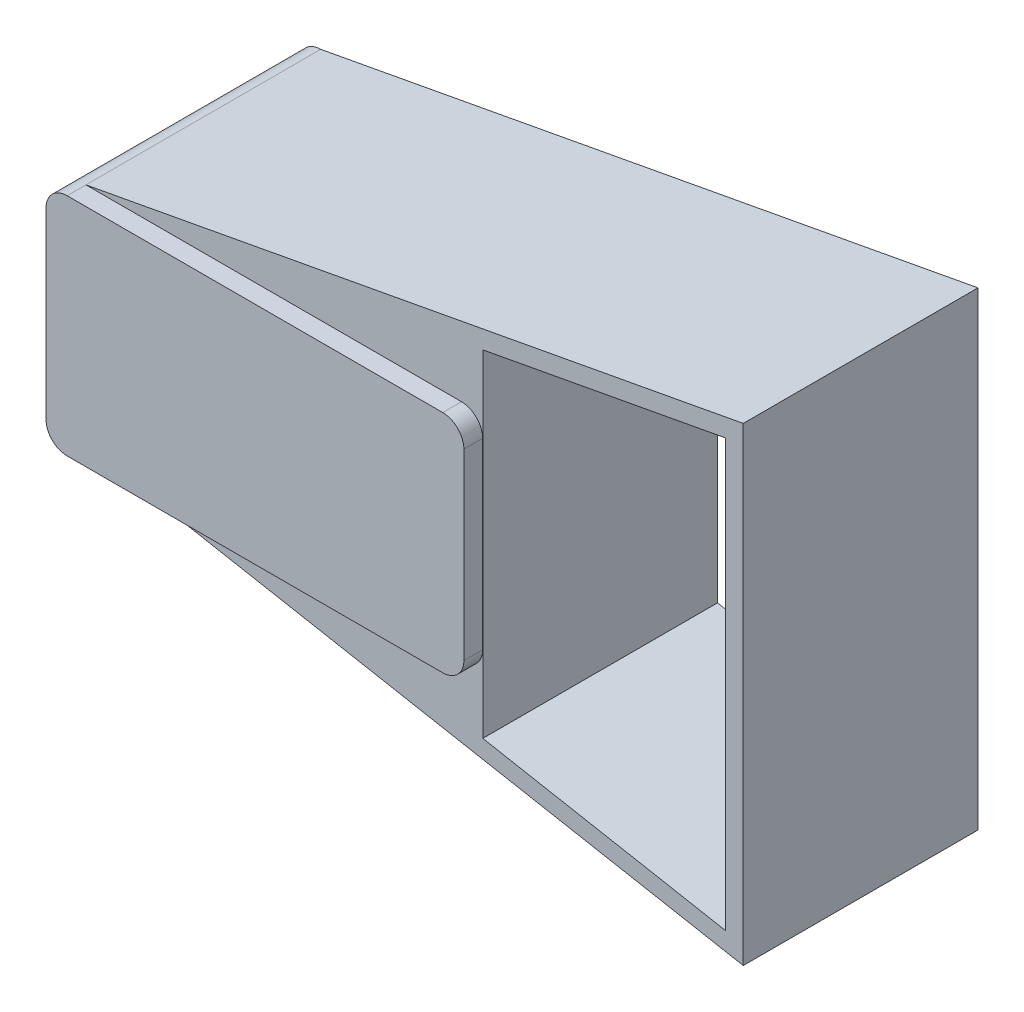
ISO-10303-21;
HEADER;
FILE_DESCRIPTION(('STEP AP214'),'2;1');
FILE_NAME('part.step','',(''),(''),'','','');
FILE_SCHEMA(('AUTOMOTIVE_DESIGN { 1 0 10303 214 1 1 1 1 }'));
ENDSEC;
DATA;
#1=APPLICATION_CONTEXT('core data for automotive mechanical design processes');
#2=APPLICATION_PROTOCOL_DEFINITION('international standard','automotive_design',2000,#1);
#3=PRODUCT_CONTEXT('',#1,'mechanical');
#4=PRODUCT('Part','Part','',(#3));
#5=PRODUCT_RELATED_PRODUCT_CATEGORY('part','',(#4));
#6=PRODUCT_DEFINITION_FORMATION('','',#4);
#7=PRODUCT_DEFINITION_CONTEXT('part definition',#1,'design');
#8=PRODUCT_DEFINITION('design','',#6,#7);
#9=PRODUCT_DEFINITION_SHAPE('','',#8);
#10=(LENGTH_UNIT() NAMED_UNIT(*) SI_UNIT(.MILLI.,.METRE.));
#11=(NAMED_UNIT(*) PLANE_ANGLE_UNIT() SI_UNIT($,.RADIAN.));
#12=(NAMED_UNIT(*) SI_UNIT($,.STERADIAN.) SOLID_ANGLE_UNIT());
#13=UNCERTAINTY_MEASURE_WITH_UNIT(LENGTH_MEASURE(1.E-05),#10,'distance_accuracy_value','');
#14=(GEOMETRIC_REPRESENTATION_CONTEXT(3) GLOBAL_UNCERTAINTY_ASSIGNED_CONTEXT((#13)) GLOBAL_UNIT_ASSIGNED_CONTEXT((#10,
#11,#12)) REPRESENTATION_CONTEXT('',''));
#15=CARTESIAN_POINT('',(0.,0.,0.));
#16=DIRECTION('',(0.,0.,1.));
#17=DIRECTION('',(1.,0.,0.));
#18=AXIS2_PLACEMENT_3D('',#15,#16,#17);
#19=CARTESIAN_POINT('',(20.,-0.25,2.));
#20=DIRECTION('',(0.,0.,-1.));
#21=DIRECTION('',(-1.,0.,0.));
#22=AXIS2_PLACEMENT_3D('',#19,#20,#21);
#23=CYLINDRICAL_SURFACE('',#22,2.25);
#24=CARTESIAN_POINT('',(20.,-0.25,0.));
#25=DIRECTION('',(0.,0.,1.));
#26=DIRECTION('',(1.,0.,0.));
#27=AXIS2_PLACEMENT_3D('',#24,#25,#26);
#28=CIRCLE('',#27,2.25);
#29=CARTESIAN_POINT('',(22.25,-0.25,0.));
#30=VERTEX_POINT('',#29);
#31=CARTESIAN_POINT('',(20.,2.,0.));
#32=VERTEX_POINT('',#31);
#33=EDGE_CURVE('E311',#30,#32,#28,.T.);
#34=ORIENTED_EDGE('',*,*,#33,.T.);
#35=DIRECTION('',(0.,0.,-1.));
#36=VECTOR('',#35,1.);
#37=CARTESIAN_POINT('',(20.,2.,2.));
#38=LINE('',#37,#36);
#39=CARTESIAN_POINT('',(20.,2.,2.));
#40=VERTEX_POINT('',#39);
#41=EDGE_CURVE('E370',#40,#32,#38,.T.);
#42=ORIENTED_EDGE('',*,*,#41,.F.);
#43=CARTESIAN_POINT('',(20.,-0.25,2.));
#44=DIRECTION('',(0.,0.,1.));
#45=DIRECTION('',(1.,0.,0.));
#46=AXIS2_PLACEMENT_3D('',#43,#44,#45);
#47=CIRCLE('',#46,2.25);
#48=CARTESIAN_POINT('',(22.25,-0.25,2.));
#49=VERTEX_POINT('',#48);
#50=EDGE_CURVE('E320',#49,#40,#47,.T.);
#51=ORIENTED_EDGE('',*,*,#50,.F.);
#52=DIRECTION('',(0.,0.,-1.));
#53=VECTOR('',#52,1.);
#54=CARTESIAN_POINT('',(22.25,-0.25,2.));
#55=LINE('',#54,#53);
#56=EDGE_CURVE('E338',#49,#30,#55,.T.);
#57=ORIENTED_EDGE('',*,*,#56,.T.);
#58=EDGE_LOOP('',(#34,#42,#51,#57));
#59=FACE_BOUND('',#58,.T.);
#60=ADVANCED_FACE('F37',(#59),#23,.T.);
#61=CARTESIAN_POINT('',(20.,2.,2.));
#62=DIRECTION('',(0.,-1.,0.));
#63=DIRECTION('',(0.,0.,-1.));
#64=AXIS2_PLACEMENT_3D('',#61,#62,#63);
#65=PLANE('',#64);
#66=DIRECTION('',(-1.,0.,0.));
#67=VECTOR('',#66,1.);
#68=CARTESIAN_POINT('',(20.,2.,0.));
#69=LINE('',#68,#67);
#70=CARTESIAN_POINT('',(-20.,2.,0.));
#71=VERTEX_POINT('',#70);
#72=EDGE_CURVE('E341',#32,#71,#69,.T.);
#73=ORIENTED_EDGE('',*,*,#72,.T.);
#74=DIRECTION('',(0.,0.,-1.));
#75=VECTOR('',#74,1.);
#76=CARTESIAN_POINT('',(-20.,2.,2.));
#77=LINE('',#76,#75);
#78=CARTESIAN_POINT('',(-20.,2.,2.));
#79=VERTEX_POINT('',#78);
#80=EDGE_CURVE('E367',#79,#71,#77,.T.);
#81=ORIENTED_EDGE('',*,*,#80,.F.);
#82=DIRECTION('',(-1.,0.,0.));
#83=VECTOR('',#82,1.);
#84=CARTESIAN_POINT('',(20.,2.,2.));
#85=LINE('',#84,#83);
#86=EDGE_CURVE('E323',#40,#79,#85,.T.);
#87=ORIENTED_EDGE('',*,*,#86,.F.);
#88=ORIENTED_EDGE('',*,*,#41,.T.);
#89=EDGE_LOOP('',(#73,#81,#87,#88));
#90=FACE_BOUND('',#89,.T.);
#91=ADVANCED_FACE('F396',(#90),#65,.F.);
#92=CARTESIAN_POINT('',(-20.,-0.25,2.));
#93=DIRECTION('',(0.,0.,-1.));
#94=DIRECTION('',(-1.,0.,0.));
#95=AXIS2_PLACEMENT_3D('',#92,#93,#94);
#96=CYLINDRICAL_SURFACE('',#95,2.25);
#97=ORIENTED_EDGE('',*,*,#80,.T.);
#98=DIRECTION('',(0.,0.,1.));
#99=VECTOR('',#98,1.);
#100=CARTESIAN_POINT('',(-20.,2.,-25.));
#101=LINE('',#100,#99);
#102=CARTESIAN_POINT('',(-20.,2.,-25.));
#103=VERTEX_POINT('',#102);
#104=EDGE_CURVE('E315',#103,#71,#101,.T.);
#105=ORIENTED_EDGE('',*,*,#104,.F.);
#106=CARTESIAN_POINT('',(-20.,-0.25,-25.));
#107=DIRECTION('',(0.,0.,-1.));
#108=DIRECTION('',(-1.,0.,0.));
#109=AXIS2_PLACEMENT_3D('',#106,#107,#108);
#110=CIRCLE('',#109,2.25);
#111=CARTESIAN_POINT('',(-22.25,-0.25,-25.));
#112=VERTEX_POINT('',#111);
#113=EDGE_CURVE('E230',#112,#103,#110,.T.);
#114=ORIENTED_EDGE('',*,*,#113,.F.);
#115=DIRECTION('',(0.,0.,-1.));
#116=VECTOR('',#115,1.);
#117=CARTESIAN_POINT('',(-22.25,-0.25,2.));
#118=LINE('',#117,#116);
#119=CARTESIAN_POINT('',(-22.25,-0.25,2.));
#120=VERTEX_POINT('',#119);
#121=EDGE_CURVE('E365',#120,#112,#118,.T.);
#122=ORIENTED_EDGE('',*,*,#121,.F.);
#123=CARTESIAN_POINT('',(-20.,-0.25,2.));
#124=DIRECTION('',(0.,0.,1.));
#125=DIRECTION('',(1.,0.,0.));
#126=AXIS2_PLACEMENT_3D('',#123,#124,#125);
#127=CIRCLE('',#126,2.25);
#128=EDGE_CURVE('E326',#79,#120,#127,.T.);
#129=ORIENTED_EDGE('',*,*,#128,.F.);
#130=EDGE_LOOP('',(#97,#105,#114,#122,#129));
#131=FACE_BOUND('',#130,.T.);
#132=ADVANCED_FACE('F401',(#131),#96,.T.);
#133=CARTESIAN_POINT('',(-22.25,-0.25,2.));
#134=DIRECTION('',(1.,0.,0.));
#135=DIRECTION('',(0.,0.,-1.));
#136=AXIS2_PLACEMENT_3D('',#133,#134,#135);
#137=PLANE('',#136);
#138=ORIENTED_EDGE('',*,*,#121,.T.);
#139=DIRECTION('',(0.,1.,0.));
#140=VECTOR('',#139,1.);
#141=CARTESIAN_POINT('',(-22.25,0.,-25.));
#142=LINE('',#141,#140);
#143=CARTESIAN_POINT('',(-22.25,-19.75,-25.));
#144=VERTEX_POINT('',#143);
#145=EDGE_CURVE('E227',#144,#112,#142,.T.);
#146=ORIENTED_EDGE('',*,*,#145,.F.);
#147=DIRECTION('',(0.,0.,-1.));
#148=VECTOR('',#147,1.);
#149=CARTESIAN_POINT('',(-22.25,-19.75,2.));
#150=LINE('',#149,#148);
#151=CARTESIAN_POINT('',(-22.25,-19.75,2.));
#152=VERTEX_POINT('',#151);
#153=EDGE_CURVE('E363',#152,#144,#150,.T.);
#154=ORIENTED_EDGE('',*,*,#153,.F.);
#155=DIRECTION('',(0.,-1.,0.));
#156=VECTOR('',#155,1.);
#157=CARTESIAN_POINT('',(-22.25,-0.25,2.));
#158=LINE('',#157,#156);
#159=EDGE_CURVE('E328',#120,#152,#158,.T.);
#160=ORIENTED_EDGE('',*,*,#159,.F.);
#161=EDGE_LOOP('',(#138,#146,#154,#160));
#162=FACE_BOUND('',#161,.T.);
#163=ADVANCED_FACE('F446',(#162),#137,.F.);
#164=CARTESIAN_POINT('',(-20.,-19.75,2.));
#165=DIRECTION('',(0.,0.,-1.));
#166=DIRECTION('',(-1.,0.,0.));
#167=AXIS2_PLACEMENT_3D('',#164,#165,#166);
#168=CYLINDRICAL_SURFACE('',#167,2.25);
#169=ORIENTED_EDGE('',*,*,#153,.T.);
#170=CARTESIAN_POINT('',(-20.,-19.75,-25.));
#171=DIRECTION('',(0.,0.,-1.));
#172=DIRECTION('',(-1.,0.,0.));
#173=AXIS2_PLACEMENT_3D('',#170,#171,#172);
#174=CIRCLE('',#173,2.25);
#175=CARTESIAN_POINT('',(-20.,-22.,-25.));
#176=VERTEX_POINT('',#175);
#177=EDGE_CURVE('E223',#176,#144,#174,.T.);
#178=ORIENTED_EDGE('',*,*,#177,.F.);
#179=DIRECTION('',(0.,0.,1.));
#180=VECTOR('',#179,1.);
#181=CARTESIAN_POINT('',(-20.,-22.,-25.));
#182=LINE('',#181,#180);
#183=CARTESIAN_POINT('',(-20.,-22.,0.));
#184=VERTEX_POINT('',#183);
#185=EDGE_CURVE('E296',#176,#184,#182,.T.);
#186=ORIENTED_EDGE('',*,*,#185,.T.);
#187=DIRECTION('',(0.,0.,-1.));
#188=VECTOR('',#187,1.);
#189=CARTESIAN_POINT('',(-20.,-22.,2.));
#190=LINE('',#189,#188);
#191=CARTESIAN_POINT('',(-20.,-22.,2.));
#192=VERTEX_POINT('',#191);
#193=EDGE_CURVE('E360',#192,#184,#190,.T.);
#194=ORIENTED_EDGE('',*,*,#193,.F.);
#195=CARTESIAN_POINT('',(-20.,-19.75,2.));
#196=DIRECTION('',(0.,0.,1.));
#197=DIRECTION('',(1.,0.,0.));
#198=AXIS2_PLACEMENT_3D('',#195,#196,#197);
#199=CIRCLE('',#198,2.25);
#200=EDGE_CURVE('E330',#152,#192,#199,.T.);
#201=ORIENTED_EDGE('',*,*,#200,.F.);
#202=EDGE_LOOP('',(#169,#178,#186,#194,#201));
#203=FACE_BOUND('',#202,.T.);
#204=ADVANCED_FACE('F421',(#203),#168,.T.);
#205=CARTESIAN_POINT('',(-20.,-22.,2.));
#206=DIRECTION('',(0.,1.,0.));
#207=DIRECTION('',(0.,0.,1.));
#208=AXIS2_PLACEMENT_3D('',#205,#206,#207);
#209=PLANE('',#208);
#210=DIRECTION('',(1.,0.,0.));
#211=VECTOR('',#210,1.);
#212=CARTESIAN_POINT('',(-20.,-22.,0.));
#213=LINE('',#212,#211);
#214=CARTESIAN_POINT('',(20.,-22.,0.));
#215=VERTEX_POINT('',#214);
#216=EDGE_CURVE('E344',#184,#215,#213,.T.);
#217=ORIENTED_EDGE('',*,*,#216,.T.);
#218=DIRECTION('',(0.,0.,-1.));
#219=VECTOR('',#218,1.);
#220=CARTESIAN_POINT('',(20.,-22.,2.));
#221=LINE('',#220,#219);
#222=CARTESIAN_POINT('',(20.,-22.,2.));
#223=VERTEX_POINT('',#222);
#224=EDGE_CURVE('E357',#223,#215,#221,.T.);
#225=ORIENTED_EDGE('',*,*,#224,.F.);
#226=DIRECTION('',(1.,0.,0.));
#227=VECTOR('',#226,1.);
#228=CARTESIAN_POINT('',(-20.,-22.,2.));
#229=LINE('',#228,#227);
#230=EDGE_CURVE('E332',#192,#223,#229,.T.);
#231=ORIENTED_EDGE('',*,*,#230,.F.);
#232=ORIENTED_EDGE('',*,*,#193,.T.);
#233=EDGE_LOOP('',(#217,#225,#231,#232));
#234=FACE_BOUND('',#233,.T.);
#235=ADVANCED_FACE('F416',(#234),#209,.F.);
#236=CARTESIAN_POINT('',(20.,-19.75,2.));
#237=DIRECTION('',(0.,0.,-1.));
#238=DIRECTION('',(-1.,0.,0.));
#239=AXIS2_PLACEMENT_3D('',#236,#237,#238);
#240=CYLINDRICAL_SURFACE('',#239,2.25);
#241=CARTESIAN_POINT('',(20.,-19.75,0.));
#242=DIRECTION('',(0.,0.,1.));
#243=DIRECTION('',(1.,0.,0.));
#244=AXIS2_PLACEMENT_3D('',#241,#242,#243);
#245=CIRCLE('',#244,2.25);
#246=CARTESIAN_POINT('',(22.25,-19.75,0.));
#247=VERTEX_POINT('',#246);
#248=EDGE_CURVE('E347',#215,#247,#245,.T.);
#249=ORIENTED_EDGE('',*,*,#248,.T.);
#250=DIRECTION('',(0.,0.,-1.));
#251=VECTOR('',#250,1.);
#252=CARTESIAN_POINT('',(22.25,-19.75,2.));
#253=LINE('',#252,#251);
#254=CARTESIAN_POINT('',(22.25,-19.75,2.));
#255=VERTEX_POINT('',#254);
#256=EDGE_CURVE('E354',#255,#247,#253,.T.);
#257=ORIENTED_EDGE('',*,*,#256,.F.);
#258=CARTESIAN_POINT('',(20.,-19.75,2.));
#259=DIRECTION('',(0.,0.,1.));
#260=DIRECTION('',(1.,0.,0.));
#261=AXIS2_PLACEMENT_3D('',#258,#259,#260);
#262=CIRCLE('',#261,2.25);
#263=EDGE_CURVE('E334',#223,#255,#262,.T.);
#264=ORIENTED_EDGE('',*,*,#263,.F.);
#265=ORIENTED_EDGE('',*,*,#224,.T.);
#266=EDGE_LOOP('',(#249,#257,#264,#265));
#267=FACE_BOUND('',#266,.T.);
#268=ADVANCED_FACE('F412',(#267),#240,.T.);
#269=CARTESIAN_POINT('',(22.25,-19.75,2.));
#270=DIRECTION('',(-1.,0.,0.));
#271=DIRECTION('',(0.,0.,1.));
#272=AXIS2_PLACEMENT_3D('',#269,#270,#271);
#273=PLANE('',#272);
#274=DIRECTION('',(0.,1.,0.));
#275=VECTOR('',#274,1.);
#276=CARTESIAN_POINT('',(22.25,-19.75,0.));
#277=LINE('',#276,#275);
#278=EDGE_CURVE('E324',#247,#30,#277,.T.);
#279=ORIENTED_EDGE('',*,*,#278,.T.);
#280=ORIENTED_EDGE('',*,*,#56,.F.);
#281=DIRECTION('',(0.,1.,0.));
#282=VECTOR('',#281,1.);
#283=CARTESIAN_POINT('',(22.25,-19.75,2.));
#284=LINE('',#283,#282);
#285=EDGE_CURVE('E336',#255,#49,#284,.T.);
#286=ORIENTED_EDGE('',*,*,#285,.F.);
#287=ORIENTED_EDGE('',*,*,#256,.T.);
#288=EDGE_LOOP('',(#279,#280,#286,#287));
#289=FACE_BOUND('',#288,.T.);
#290=ADVANCED_FACE('F407',(#289),#273,.F.);
#291=CARTESIAN_POINT('',(20.,-0.25,2.));
#292=DIRECTION('',(0.,0.,1.));
#293=DIRECTION('',(1.,0.,0.));
#294=AXIS2_PLACEMENT_3D('',#291,#292,#293);
#295=PLANE('',#294);
#296=ORIENTED_EDGE('',*,*,#50,.T.);
#297=ORIENTED_EDGE('',*,*,#86,.T.);
#298=ORIENTED_EDGE('',*,*,#128,.T.);
#299=ORIENTED_EDGE('',*,*,#159,.T.);
#300=ORIENTED_EDGE('',*,*,#200,.T.);
#301=ORIENTED_EDGE('',*,*,#230,.T.);
#302=ORIENTED_EDGE('',*,*,#263,.T.);
#303=ORIENTED_EDGE('',*,*,#285,.T.);
#304=EDGE_LOOP('',(#296,#297,#298,#299,#300,#301,#302,#303));
#305=FACE_BOUND('',#304,.T.);
#306=ADVANCED_FACE('F442',(#305),#295,.T.);
#307=CARTESIAN_POINT('',(-20.,-0.25,-25.));
#308=DIRECTION('',(0.,0.,1.));
#309=DIRECTION('',(1.,0.,0.));
#310=AXIS2_PLACEMENT_3D('',#307,#308,#309);
#311=CYLINDRICAL_SURFACE('',#310,0.349999999999999);
#312=CARTESIAN_POINT('',(-20.,-0.25,0.));
#313=DIRECTION('',(0.,0.,-1.));
#314=DIRECTION('',(-1.,0.,0.));
#315=AXIS2_PLACEMENT_3D('',#312,#313,#314);
#316=CIRCLE('',#315,0.349999999999999);
#317=CARTESIAN_POINT('',(-20.35,-0.25,0.));
#318=VERTEX_POINT('',#317);
#319=CARTESIAN_POINT('',(-20.,0.0999999999999987,0.));
#320=VERTEX_POINT('',#319);
#321=EDGE_CURVE('E270',#318,#320,#316,.T.);
#322=ORIENTED_EDGE('',*,*,#321,.F.);
#323=DIRECTION('',(0.,0.,1.));
#324=VECTOR('',#323,1.);
#325=CARTESIAN_POINT('',(-20.35,-0.25,-25.));
#326=LINE('',#325,#324);
#327=CARTESIAN_POINT('',(-20.35,-0.25,-25.));
#328=VERTEX_POINT('',#327);
#329=EDGE_CURVE('E308',#328,#318,#326,.T.);
#330=ORIENTED_EDGE('',*,*,#329,.F.);
#331=CARTESIAN_POINT('',(-20.,-0.25,-25.));
#332=DIRECTION('',(0.,0.,-1.));
#333=DIRECTION('',(-1.,0.,0.));
#334=AXIS2_PLACEMENT_3D('',#331,#332,#333);
#335=CIRCLE('',#334,0.349999999999999);
#336=CARTESIAN_POINT('',(-20.,0.0999999999999987,-25.));
#337=VERTEX_POINT('',#336);
#338=EDGE_CURVE('E238',#328,#337,#335,.T.);
#339=ORIENTED_EDGE('',*,*,#338,.T.);
#340=DIRECTION('',(0.,0.,1.));
#341=VECTOR('',#340,1.);
#342=CARTESIAN_POINT('',(-20.,0.0999999999999987,-25.));
#343=LINE('',#342,#341);
#344=EDGE_CURVE('E293',#337,#320,#343,.T.);
#345=ORIENTED_EDGE('',*,*,#344,.T.);
#346=EDGE_LOOP('',(#322,#330,#339,#345));
#347=FACE_BOUND('',#346,.T.);
#348=ADVANCED_FACE('F479',(#347),#311,.F.);
#349=CARTESIAN_POINT('',(-20.35,0.,-25.));
#350=DIRECTION('',(1.,0.,0.));
#351=DIRECTION('',(0.,0.,-1.));
#352=AXIS2_PLACEMENT_3D('',#349,#350,#351);
#353=PLANE('',#352);
#354=DIRECTION('',(0.,1.,0.));
#355=VECTOR('',#354,1.);
#356=CARTESIAN_POINT('',(-20.35,0.,0.));
#357=LINE('',#356,#355);
#358=CARTESIAN_POINT('',(-20.35,-19.75,0.));
#359=VERTEX_POINT('',#358);
#360=EDGE_CURVE('E273',#359,#318,#357,.T.);
#361=ORIENTED_EDGE('',*,*,#360,.F.);
#362=DIRECTION('',(0.,0.,1.));
#363=VECTOR('',#362,1.);
#364=CARTESIAN_POINT('',(-20.35,-19.75,-25.));
#365=LINE('',#364,#363);
#366=CARTESIAN_POINT('',(-20.35,-19.75,-25.));
#367=VERTEX_POINT('',#366);
#368=EDGE_CURVE('E306',#367,#359,#365,.T.);
#369=ORIENTED_EDGE('',*,*,#368,.F.);
#370=DIRECTION('',(0.,1.,0.));
#371=VECTOR('',#370,1.);
#372=CARTESIAN_POINT('',(-20.35,0.,-25.));
#373=LINE('',#372,#371);
#374=EDGE_CURVE('E241',#367,#328,#373,.T.);
#375=ORIENTED_EDGE('',*,*,#374,.T.);
#376=ORIENTED_EDGE('',*,*,#329,.T.);
#377=EDGE_LOOP('',(#361,#369,#375,#376));
#378=FACE_BOUND('',#377,.T.);
#379=ADVANCED_FACE('F458',(#378),#353,.T.);
#380=CARTESIAN_POINT('',(-20.,-19.75,-25.));
#381=DIRECTION('',(0.,0.,1.));
#382=DIRECTION('',(1.,0.,0.));
#383=AXIS2_PLACEMENT_3D('',#380,#381,#382);
#384=CYLINDRICAL_SURFACE('',#383,0.35);
#385=CARTESIAN_POINT('',(-20.,-19.75,0.));
#386=DIRECTION('',(0.,0.,-1.));
#387=DIRECTION('',(-1.,0.,0.));
#388=AXIS2_PLACEMENT_3D('',#385,#386,#387);
#389=CIRCLE('',#388,0.35);
#390=CARTESIAN_POINT('',(-20.,-20.1,0.));
#391=VERTEX_POINT('',#390);
#392=EDGE_CURVE('E276',#391,#359,#389,.T.);
#393=ORIENTED_EDGE('',*,*,#392,.F.);
#394=DIRECTION('',(0.,0.,1.));
#395=VECTOR('',#394,1.);
#396=CARTESIAN_POINT('',(-20.,-20.1,-25.));
#397=LINE('',#396,#395);
#398=CARTESIAN_POINT('',(-20.,-20.1,-25.));
#399=VERTEX_POINT('',#398);
#400=EDGE_CURVE('E304',#399,#391,#397,.T.);
#401=ORIENTED_EDGE('',*,*,#400,.F.);
#402=CARTESIAN_POINT('',(-20.,-19.75,-25.));
#403=DIRECTION('',(0.,0.,-1.));
#404=DIRECTION('',(-1.,0.,0.));
#405=AXIS2_PLACEMENT_3D('',#402,#403,#404);
#406=CIRCLE('',#405,0.35);
#407=EDGE_CURVE('E244',#399,#367,#406,.T.);
#408=ORIENTED_EDGE('',*,*,#407,.T.);
#409=ORIENTED_EDGE('',*,*,#368,.T.);
#410=EDGE_LOOP('',(#393,#401,#408,#409));
#411=FACE_BOUND('',#410,.T.);
#412=ADVANCED_FACE('F461',(#411),#384,.F.);
#413=CARTESIAN_POINT('',(0.,-20.1,-25.));
#414=DIRECTION('',(0.,1.,0.));
#415=DIRECTION('',(0.,0.,1.));
#416=AXIS2_PLACEMENT_3D('',#413,#414,#415);
#417=PLANE('',#416);
#418=DIRECTION('',(-1.,0.,0.));
#419=VECTOR('',#418,1.);
#420=CARTESIAN_POINT('',(0.,-20.1,0.));
#421=LINE('',#420,#419);
#422=CARTESIAN_POINT('',(20.,-20.1,0.));
#423=VERTEX_POINT('',#422);
#424=EDGE_CURVE('E279',#423,#391,#421,.T.);
#425=ORIENTED_EDGE('',*,*,#424,.F.);
#426=DIRECTION('',(0.,0.,1.));
#427=VECTOR('',#426,1.);
#428=CARTESIAN_POINT('',(20.,-20.1,-25.));
#429=LINE('',#428,#427);
#430=CARTESIAN_POINT('',(20.,-20.1,-25.));
#431=VERTEX_POINT('',#430);
#432=EDGE_CURVE('E302',#431,#423,#429,.T.);
#433=ORIENTED_EDGE('',*,*,#432,.F.);
#434=DIRECTION('',(-1.,0.,0.));
#435=VECTOR('',#434,1.);
#436=CARTESIAN_POINT('',(0.,-20.1,-25.));
#437=LINE('',#436,#435);
#438=EDGE_CURVE('E247',#431,#399,#437,.T.);
#439=ORIENTED_EDGE('',*,*,#438,.T.);
#440=ORIENTED_EDGE('',*,*,#400,.T.);
#441=EDGE_LOOP('',(#425,#433,#439,#440));
#442=FACE_BOUND('',#441,.T.);
#443=ADVANCED_FACE('F466',(#442),#417,.T.);
#444=CARTESIAN_POINT('',(20.,-19.75,-25.));
#445=DIRECTION('',(0.,0.,1.));
#446=DIRECTION('',(1.,0.,0.));
#447=AXIS2_PLACEMENT_3D('',#444,#445,#446);
#448=CYLINDRICAL_SURFACE('',#447,0.35);
#449=CARTESIAN_POINT('',(20.,-19.75,0.));
#450=DIRECTION('',(0.,0.,-1.));
#451=DIRECTION('',(-1.,0.,0.));
#452=AXIS2_PLACEMENT_3D('',#449,#450,#451);
#453=CIRCLE('',#452,0.35);
#454=CARTESIAN_POINT('',(20.35,-19.75,0.));
#455=VERTEX_POINT('',#454);
#456=EDGE_CURVE('E282',#455,#423,#453,.T.);
#457=ORIENTED_EDGE('',*,*,#456,.F.);
#458=DIRECTION('',(0.,0.,1.));
#459=VECTOR('',#458,1.);
#460=CARTESIAN_POINT('',(20.35,-19.75,-25.));
#461=LINE('',#460,#459);
#462=CARTESIAN_POINT('',(20.35,-19.75,-25.));
#463=VERTEX_POINT('',#462);
#464=EDGE_CURVE('E300',#463,#455,#461,.T.);
#465=ORIENTED_EDGE('',*,*,#464,.F.);
#466=CARTESIAN_POINT('',(20.,-19.75,-25.));
#467=DIRECTION('',(0.,0.,-1.));
#468=DIRECTION('',(-1.,0.,0.));
#469=AXIS2_PLACEMENT_3D('',#466,#467,#468);
#470=CIRCLE('',#469,0.35);
#471=EDGE_CURVE('E250',#463,#431,#470,.T.);
#472=ORIENTED_EDGE('',*,*,#471,.T.);
#473=ORIENTED_EDGE('',*,*,#432,.T.);
#474=EDGE_LOOP('',(#457,#465,#472,#473));
#475=FACE_BOUND('',#474,.T.);
#476=ADVANCED_FACE('F469',(#475),#448,.F.);
#477=CARTESIAN_POINT('',(20.35,0.,-25.));
#478=DIRECTION('',(-1.,0.,0.));
#479=DIRECTION('',(0.,0.,1.));
#480=AXIS2_PLACEMENT_3D('',#477,#478,#479);
#481=PLANE('',#480);
#482=DIRECTION('',(0.,-1.,0.));
#483=VECTOR('',#482,1.);
#484=CARTESIAN_POINT('',(20.35,0.,0.));
#485=LINE('',#484,#483);
#486=CARTESIAN_POINT('',(20.35,-0.25,0.));
#487=VERTEX_POINT('',#486);
#488=EDGE_CURVE('E285',#487,#455,#485,.T.);
#489=ORIENTED_EDGE('',*,*,#488,.F.);
#490=DIRECTION('',(0.,0.,1.));
#491=VECTOR('',#490,1.);
#492=CARTESIAN_POINT('',(20.35,-0.25,-25.));
#493=LINE('',#492,#491);
#494=CARTESIAN_POINT('',(20.35,-0.25,-25.));
#495=VERTEX_POINT('',#494);
#496=EDGE_CURVE('E298',#495,#487,#493,.T.);
#497=ORIENTED_EDGE('',*,*,#496,.F.);
#498=DIRECTION('',(0.,-1.,0.));
#499=VECTOR('',#498,1.);
#500=CARTESIAN_POINT('',(20.35,0.,-25.));
#501=LINE('',#500,#499);
#502=EDGE_CURVE('E253',#495,#463,#501,.T.);
#503=ORIENTED_EDGE('',*,*,#502,.T.);
#504=ORIENTED_EDGE('',*,*,#464,.T.);
#505=EDGE_LOOP('',(#489,#497,#503,#504));
#506=FACE_BOUND('',#505,.T.);
#507=ADVANCED_FACE('F473',(#506),#481,.T.);
#508=CARTESIAN_POINT('',(20.,-0.25,-25.));
#509=DIRECTION('',(0.,0.,1.));
#510=DIRECTION('',(1.,0.,0.));
#511=AXIS2_PLACEMENT_3D('',#508,#509,#510);
#512=CYLINDRICAL_SURFACE('',#511,0.349999999999999);
#513=CARTESIAN_POINT('',(20.,-0.25,0.));
#514=DIRECTION('',(0.,0.,-1.));
#515=DIRECTION('',(-1.,0.,0.));
#516=AXIS2_PLACEMENT_3D('',#513,#514,#515);
#517=CIRCLE('',#516,0.349999999999999);
#518=CARTESIAN_POINT('',(20.,0.0999999999999987,0.));
#519=VERTEX_POINT('',#518);
#520=EDGE_CURVE('E288',#519,#487,#517,.T.);
#521=ORIENTED_EDGE('',*,*,#520,.F.);
#522=DIRECTION('',(0.,0.,1.));
#523=VECTOR('',#522,1.);
#524=CARTESIAN_POINT('',(20.,0.0999999999999987,-25.));
#525=LINE('',#524,#523);
#526=CARTESIAN_POINT('',(20.,0.0999999999999987,-25.));
#527=VERTEX_POINT('',#526);
#528=EDGE_CURVE('E295',#527,#519,#525,.T.);
#529=ORIENTED_EDGE('',*,*,#528,.F.);
#530=CARTESIAN_POINT('',(20.,-0.25,-25.));
#531=DIRECTION('',(0.,0.,-1.));
#532=DIRECTION('',(-1.,0.,0.));
#533=AXIS2_PLACEMENT_3D('',#530,#531,#532);
#534=CIRCLE('',#533,0.349999999999999);
#535=EDGE_CURVE('E256',#527,#495,#534,.T.);
#536=ORIENTED_EDGE('',*,*,#535,.T.);
#537=ORIENTED_EDGE('',*,*,#496,.T.);
#538=EDGE_LOOP('',(#521,#529,#536,#537));
#539=FACE_BOUND('',#538,.T.);
#540=ADVANCED_FACE('F476',(#539),#512,.F.);
#541=CARTESIAN_POINT('',(-4.61629512724404,-24.8569737620832,-25.));
#542=DIRECTION('',(0.182592193842777,0.983188736076488,0.));
#543=DIRECTION('',(-0.983188736076488,0.182592193842777,0.));
#544=AXIS2_PLACEMENT_3D('',#541,#542,#543);
#545=PLANE('',#544);
#546=DIRECTION('',(-0.983188736076488,0.182592193842777,0.));
#547=VECTOR('',#546,1.);
#548=CARTESIAN_POINT('',(-4.61629512724404,-24.8569737620832,0.));
#549=LINE('',#548,#547);
#550=CARTESIAN_POINT('',(50.,-35.,0.));
#551=VERTEX_POINT('',#550);
#552=EDGE_CURVE('E217',#551,#184,#549,.T.);
#553=ORIENTED_EDGE('',*,*,#552,.T.);
#554=ORIENTED_EDGE('',*,*,#185,.F.);
#555=DIRECTION('',(-0.983188736076488,0.182592193842777,0.));
#556=VECTOR('',#555,1.);
#557=CARTESIAN_POINT('',(-4.61629512724404,-24.8569737620832,-25.));
#558=LINE('',#557,#556);
#559=CARTESIAN_POINT('',(50.,-35.,-25.));
#560=VERTEX_POINT('',#559);
#561=EDGE_CURVE('E220',#560,#176,#558,.T.);
#562=ORIENTED_EDGE('',*,*,#561,.F.);
#563=DIRECTION('',(0.,0.,1.));
#564=VECTOR('',#563,1.);
#565=CARTESIAN_POINT('',(50.,-35.,-25.));
#566=LINE('',#565,#564);
#567=EDGE_CURVE('E262',#560,#551,#566,.T.);
#568=ORIENTED_EDGE('',*,*,#567,.T.);
#569=EDGE_LOOP('',(#553,#554,#562,#568));
#570=FACE_BOUND('',#569,.T.);
#571=ADVANCED_FACE('F425',(#570),#545,.F.);
#572=CARTESIAN_POINT('',(-1.02584336160978,5.52377194712961,-25.));
#573=DIRECTION('',(-0.182592193842776,0.983188736076488,0.));
#574=DIRECTION('',(-0.983188736076488,-0.182592193842776,0.));
#575=AXIS2_PLACEMENT_3D('',#572,#573,#574);
#576=PLANE('',#575);
#577=DIRECTION('',(-0.983188736076488,-0.182592193842776,0.));
#578=VECTOR('',#577,1.);
#579=CARTESIAN_POINT('',(-1.02584336160978,5.52377194712961,0.));
#580=LINE('',#579,#578);
#581=CARTESIAN_POINT('',(50.,15.,0.));
#582=VERTEX_POINT('',#581);
#583=EDGE_CURVE('E265',#582,#71,#580,.T.);
#584=ORIENTED_EDGE('',*,*,#583,.F.);
#585=DIRECTION('',(0.,0.,1.));
#586=VECTOR('',#585,1.);
#587=CARTESIAN_POINT('',(50.,15.,-25.));
#588=LINE('',#587,#586);
#589=CARTESIAN_POINT('',(50.,15.,-25.));
#590=VERTEX_POINT('',#589);
#591=EDGE_CURVE('E313',#590,#582,#588,.T.);
#592=ORIENTED_EDGE('',*,*,#591,.F.);
#593=DIRECTION('',(-0.983188736076488,-0.182592193842776,0.));
#594=VECTOR('',#593,1.);
#595=CARTESIAN_POINT('',(-1.02584336160978,5.52377194712961,-25.));
#596=LINE('',#595,#594);
#597=EDGE_CURVE('E232',#590,#103,#596,.T.);
#598=ORIENTED_EDGE('',*,*,#597,.T.);
#599=ORIENTED_EDGE('',*,*,#104,.T.);
#600=EDGE_LOOP('',(#584,#592,#598,#599));
#601=FACE_BOUND('',#600,.T.);
#602=ADVANCED_FACE('F433',(#601),#576,.T.);
#603=CARTESIAN_POINT('',(50.,0.,-25.));
#604=DIRECTION('',(1.,0.,0.));
#605=DIRECTION('',(0.,1.,0.));
#606=AXIS2_PLACEMENT_3D('',#603,#604,#605);
#607=PLANE('',#606);
#608=DIRECTION('',(0.,1.,0.));
#609=VECTOR('',#608,1.);
#610=CARTESIAN_POINT('',(50.,0.,0.));
#611=LINE('',#610,#609);
#612=EDGE_CURVE('E267',#551,#582,#611,.T.);
#613=ORIENTED_EDGE('',*,*,#612,.F.);
#614=ORIENTED_EDGE('',*,*,#567,.F.);
#615=DIRECTION('',(0.,1.,0.));
#616=VECTOR('',#615,1.);
#617=CARTESIAN_POINT('',(50.,0.,-25.));
#618=LINE('',#617,#616);
#619=EDGE_CURVE('E235',#560,#590,#618,.T.);
#620=ORIENTED_EDGE('',*,*,#619,.T.);
#621=ORIENTED_EDGE('',*,*,#591,.T.);
#622=EDGE_LOOP('',(#613,#614,#620,#621));
#623=FACE_BOUND('',#622,.T.);
#624=ADVANCED_FACE('F428',(#623),#607,.T.);
#625=CARTESIAN_POINT('',(0.,0.0999999999999987,-25.));
#626=DIRECTION('',(0.,-1.,0.));
#627=DIRECTION('',(0.,0.,-1.));
#628=AXIS2_PLACEMENT_3D('',#625,#626,#627);
#629=PLANE('',#628);
#630=DIRECTION('',(1.,0.,0.));
#631=VECTOR('',#630,1.);
#632=CARTESIAN_POINT('',(0.,0.0999999999999987,0.));
#633=LINE('',#632,#631);
#634=EDGE_CURVE('E224',#320,#519,#633,.T.);
#635=ORIENTED_EDGE('',*,*,#634,.F.);
#636=ORIENTED_EDGE('',*,*,#344,.F.);
#637=DIRECTION('',(1.,0.,0.));
#638=VECTOR('',#637,1.);
#639=CARTESIAN_POINT('',(0.,0.0999999999999987,-25.));
#640=LINE('',#639,#638);
#641=EDGE_CURVE('E259',#337,#527,#640,.T.);
#642=ORIENTED_EDGE('',*,*,#641,.T.);
#643=ORIENTED_EDGE('',*,*,#528,.T.);
#644=EDGE_LOOP('',(#635,#636,#642,#643));
#645=FACE_BOUND('',#644,.T.);
#646=ADVANCED_FACE('F449',(#645),#629,.T.);
#647=CARTESIAN_POINT('',(0.,0.,-25.));
#648=DIRECTION('',(0.,0.,-1.));
#649=DIRECTION('',(-1.,0.,0.));
#650=AXIS2_PLACEMENT_3D('',#647,#648,#649);
#651=PLANE('',#650);
#652=DIRECTION('',(0.983188736076488,0.182592193842776,0.));
#653=VECTOR('',#652,1.);
#654=CARTESIAN_POINT('',(-0.678918193308509,3.65571334858428,-25.));
#655=LINE('',#654,#653);
#656=CARTESIAN_POINT('',(22.2642021300828,7.91657855149981,-25.));
#657=VERTEX_POINT('',#656);
#658=CARTESIAN_POINT('',(48.1,12.7146552987701,-25.));
#659=VERTEX_POINT('',#658);
#660=EDGE_CURVE('E51',#657,#659,#655,.T.);
#661=ORIENTED_EDGE('',*,*,#660,.F.);
#662=DIRECTION('',(0.,-1.,0.));
#663=VECTOR('',#662,1.);
#664=CARTESIAN_POINT('',(22.2642021300828,0.,-25.));
#665=LINE('',#664,#663);
#666=CARTESIAN_POINT('',(22.2642021300828,-27.9165785514998,-25.));
#667=VERTEX_POINT('',#666);
#668=EDGE_CURVE('E210',#657,#667,#665,.T.);
#669=ORIENTED_EDGE('',*,*,#668,.T.);
#670=DIRECTION('',(-0.983188736076488,0.182592193842776,0.));
#671=VECTOR('',#670,1.);
#672=CARTESIAN_POINT('',(-4.26936995894276,-22.9889151635379,-25.));
#673=LINE('',#672,#671);
#674=CARTESIAN_POINT('',(48.1,-32.7146552987702,-25.));
#675=VERTEX_POINT('',#674);
#676=EDGE_CURVE('E194',#675,#667,#673,.T.);
#677=ORIENTED_EDGE('',*,*,#676,.F.);
#678=DIRECTION('',(0.,-1.,0.));
#679=VECTOR('',#678,1.);
#680=CARTESIAN_POINT('',(48.1,0.,-25.));
#681=LINE('',#680,#679);
#682=EDGE_CURVE('E203',#659,#675,#681,.T.);
#683=ORIENTED_EDGE('',*,*,#682,.F.);
#684=EDGE_LOOP('',(#661,#669,#677,#683));
#685=FACE_BOUND('',#684,.T.);
#686=ORIENTED_EDGE('',*,*,#561,.T.);
#687=ORIENTED_EDGE('',*,*,#177,.T.);
#688=ORIENTED_EDGE('',*,*,#145,.T.);
#689=ORIENTED_EDGE('',*,*,#113,.T.);
#690=ORIENTED_EDGE('',*,*,#597,.F.);
#691=ORIENTED_EDGE('',*,*,#619,.F.);
#692=EDGE_LOOP('',(#686,#687,#688,#689,#690,#691));
#693=FACE_BOUND('',#692,.T.);
#694=ORIENTED_EDGE('',*,*,#338,.F.);
#695=ORIENTED_EDGE('',*,*,#374,.F.);
#696=ORIENTED_EDGE('',*,*,#407,.F.);
#697=ORIENTED_EDGE('',*,*,#438,.F.);
#698=ORIENTED_EDGE('',*,*,#471,.F.);
#699=ORIENTED_EDGE('',*,*,#502,.F.);
#700=ORIENTED_EDGE('',*,*,#535,.F.);
#701=ORIENTED_EDGE('',*,*,#641,.F.);
#702=EDGE_LOOP('',(#694,#695,#696,#697,#698,#699,#700,#701));
#703=FACE_BOUND('',#702,.T.);
#704=ADVANCED_FACE('F207',(#685,#693,#703),#651,.T.);
#705=CARTESIAN_POINT('',(0.,0.,0.));
#706=DIRECTION('',(0.,0.,-1.));
#707=DIRECTION('',(-1.,0.,0.));
#708=AXIS2_PLACEMENT_3D('',#705,#706,#707);
#709=PLANE('',#708);
#710=DIRECTION('',(0.,-1.,0.));
#711=VECTOR('',#710,1.);
#712=CARTESIAN_POINT('',(22.2642021300828,0.,0.));
#713=LINE('',#712,#711);
#714=CARTESIAN_POINT('',(22.2642021300828,7.91657855149981,0.));
#715=VERTEX_POINT('',#714);
#716=CARTESIAN_POINT('',(22.2642021300828,-27.9165785514998,0.));
#717=VERTEX_POINT('',#716);
#718=EDGE_CURVE('E44',#715,#717,#713,.T.);
#719=ORIENTED_EDGE('',*,*,#718,.F.);
#720=DIRECTION('',(0.983188736076488,0.182592193842776,0.));
#721=VECTOR('',#720,1.);
#722=CARTESIAN_POINT('',(-0.678918193308509,3.65571334858428,0.));
#723=LINE('',#722,#721);
#724=CARTESIAN_POINT('',(48.1,12.7146552987701,0.));
#725=VERTEX_POINT('',#724);
#726=EDGE_CURVE('E11',#715,#725,#723,.T.);
#727=ORIENTED_EDGE('',*,*,#726,.T.);
#728=DIRECTION('',(0.,-1.,0.));
#729=VECTOR('',#728,1.);
#730=CARTESIAN_POINT('',(48.1,0.,0.));
#731=LINE('',#730,#729);
#732=CARTESIAN_POINT('',(48.1,-32.7146552987702,0.));
#733=VERTEX_POINT('',#732);
#734=EDGE_CURVE('E373',#725,#733,#731,.T.);
#735=ORIENTED_EDGE('',*,*,#734,.T.);
#736=DIRECTION('',(-0.983188736076488,0.182592193842776,0.));
#737=VECTOR('',#736,1.);
#738=CARTESIAN_POINT('',(-4.26936995894276,-22.9889151635379,0.));
#739=LINE('',#738,#737);
#740=EDGE_CURVE('E197',#733,#717,#739,.T.);
#741=ORIENTED_EDGE('',*,*,#740,.T.);
#742=EDGE_LOOP('',(#719,#727,#735,#741));
#743=FACE_BOUND('',#742,.T.);
#744=ORIENTED_EDGE('',*,*,#216,.F.);
#745=ORIENTED_EDGE('',*,*,#552,.F.);
#746=ORIENTED_EDGE('',*,*,#612,.T.);
#747=ORIENTED_EDGE('',*,*,#583,.T.);
#748=ORIENTED_EDGE('',*,*,#72,.F.);
#749=ORIENTED_EDGE('',*,*,#33,.F.);
#750=ORIENTED_EDGE('',*,*,#278,.F.);
#751=ORIENTED_EDGE('',*,*,#248,.F.);
#752=EDGE_LOOP('',(#744,#745,#746,#747,#748,#749,#750,#751));
#753=FACE_BOUND('',#752,.T.);
#754=ADVANCED_FACE('F380',(#743,#753),#709,.F.);
#755=CARTESIAN_POINT('',(20.,-0.25,0.));
#756=DIRECTION('',(0.,0.,1.));
#757=DIRECTION('',(1.,0.,0.));
#758=AXIS2_PLACEMENT_3D('',#755,#756,#757);
#759=PLANE('',#758);
#760=ORIENTED_EDGE('',*,*,#360,.T.);
#761=ORIENTED_EDGE('',*,*,#321,.T.);
#762=ORIENTED_EDGE('',*,*,#634,.T.);
#763=ORIENTED_EDGE('',*,*,#520,.T.);
#764=ORIENTED_EDGE('',*,*,#488,.T.);
#765=ORIENTED_EDGE('',*,*,#456,.T.);
#766=ORIENTED_EDGE('',*,*,#424,.T.);
#767=ORIENTED_EDGE('',*,*,#392,.T.);
#768=EDGE_LOOP('',(#760,#761,#762,#763,#764,#765,#766,#767));
#769=FACE_BOUND('',#768,.T.);
#770=ADVANCED_FACE('F384',(#769),#759,.F.);
#771=CARTESIAN_POINT('',(-0.678918193308509,3.65571334858428,25.));
#772=DIRECTION('',(-0.182592193842776,0.983188736076488,0.));
#773=DIRECTION('',(-0.983188736076488,-0.182592193842776,0.));
#774=AXIS2_PLACEMENT_3D('',#771,#772,#773);
#775=PLANE('',#774);
#776=DIRECTION('',(0.,0.,-1.));
#777=VECTOR('',#776,1.);
#778=CARTESIAN_POINT('',(22.2642021300828,7.91657855149981,25.));
#779=LINE('',#778,#777);
#780=EDGE_CURVE('E215',#715,#657,#779,.T.);
#781=ORIENTED_EDGE('',*,*,#780,.T.);
#782=ORIENTED_EDGE('',*,*,#660,.T.);
#783=DIRECTION('',(0.,0.,-1.));
#784=VECTOR('',#783,1.);
#785=CARTESIAN_POINT('',(48.1,12.7146552987701,25.));
#786=LINE('',#785,#784);
#787=EDGE_CURVE('E200',#725,#659,#786,.T.);
#788=ORIENTED_EDGE('',*,*,#787,.F.);
#789=ORIENTED_EDGE('',*,*,#726,.F.);
#790=EDGE_LOOP('',(#781,#782,#788,#789));
#791=FACE_BOUND('',#790,.T.);
#792=ADVANCED_FACE('F382',(#791),#775,.F.);
#793=CARTESIAN_POINT('',(22.2642021300828,0.,25.));
#794=DIRECTION('',(1.,0.,0.));
#795=DIRECTION('',(0.,1.,0.));
#796=AXIS2_PLACEMENT_3D('',#793,#794,#795);
#797=PLANE('',#796);
#798=ORIENTED_EDGE('',*,*,#718,.T.);
#799=DIRECTION('',(0.,0.,-1.));
#800=VECTOR('',#799,1.);
#801=CARTESIAN_POINT('',(22.2642021300828,-27.9165785514998,25.));
#802=LINE('',#801,#800);
#803=EDGE_CURVE('E199',#717,#667,#802,.T.);
#804=ORIENTED_EDGE('',*,*,#803,.T.);
#805=ORIENTED_EDGE('',*,*,#668,.F.);
#806=ORIENTED_EDGE('',*,*,#780,.F.);
#807=EDGE_LOOP('',(#798,#804,#805,#806));
#808=FACE_BOUND('',#807,.T.);
#809=ADVANCED_FACE('F378',(#808),#797,.T.);
#810=CARTESIAN_POINT('',(-4.26936995894276,-22.9889151635379,25.));
#811=DIRECTION('',(-0.182592193842776,-0.983188736076488,0.));
#812=DIRECTION('',(0.983188736076488,-0.182592193842776,0.));
#813=AXIS2_PLACEMENT_3D('',#810,#811,#812);
#814=PLANE('',#813);
#815=DIRECTION('',(0.,0.,-1.));
#816=VECTOR('',#815,1.);
#817=CARTESIAN_POINT('',(48.1,-32.7146552987702,25.));
#818=LINE('',#817,#816);
#819=EDGE_CURVE('E59',#733,#675,#818,.T.);
#820=ORIENTED_EDGE('',*,*,#819,.T.);
#821=ORIENTED_EDGE('',*,*,#676,.T.);
#822=ORIENTED_EDGE('',*,*,#803,.F.);
#823=ORIENTED_EDGE('',*,*,#740,.F.);
#824=EDGE_LOOP('',(#820,#821,#822,#823));
#825=FACE_BOUND('',#824,.T.);
#826=ADVANCED_FACE('F191',(#825),#814,.F.);
#827=CARTESIAN_POINT('',(48.1,0.,25.));
#828=DIRECTION('',(1.,0.,0.));
#829=DIRECTION('',(0.,1.,0.));
#830=AXIS2_PLACEMENT_3D('',#827,#828,#829);
#831=PLANE('',#830);
#832=ORIENTED_EDGE('',*,*,#787,.T.);
#833=ORIENTED_EDGE('',*,*,#682,.T.);
#834=ORIENTED_EDGE('',*,*,#819,.F.);
#835=ORIENTED_EDGE('',*,*,#734,.F.);
#836=EDGE_LOOP('',(#832,#833,#834,#835));
#837=FACE_BOUND('',#836,.T.);
#838=ADVANCED_FACE('F204',(#837),#831,.F.);
#839=CLOSED_SHELL('',(#60,#91,#132,#163,#204,#235,#268,#290,#306,#348,#379,#412,#443,#476,#507,
#540,#571,#602,#624,#646,#704,#754,#770,#792,#809,#826,#838));
#840=MANIFOLD_SOLID_BREP('B2',#839);
#841=ADVANCED_BREP_SHAPE_REPRESENTATION('',(#18,#840),#14);
#842=SHAPE_DEFINITION_REPRESENTATION(#9,#841);
ENDSEC;
END-ISO-10303-21;
